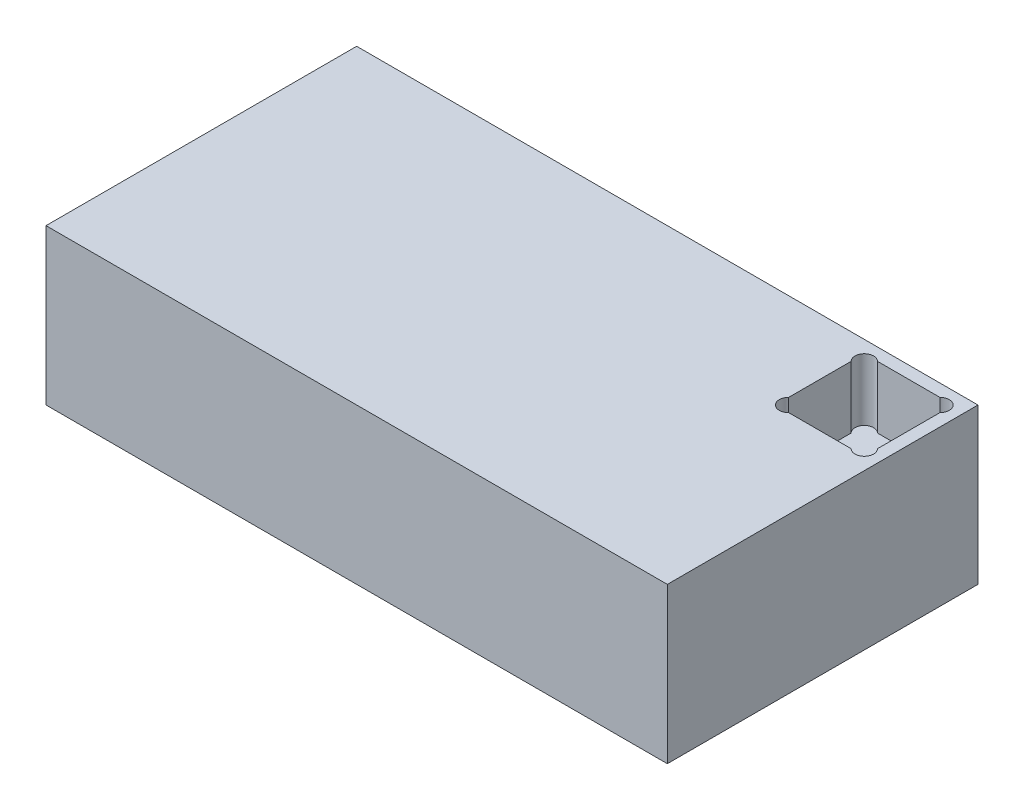
ISO-10303-21;
HEADER;
FILE_DESCRIPTION(('STEP AP214'),'2;1');
FILE_NAME('part.step','',(''),(''),'','','');
FILE_SCHEMA(('AUTOMOTIVE_DESIGN { 1 0 10303 214 1 1 1 1 }'));
ENDSEC;
DATA;
#1=APPLICATION_CONTEXT('core data for automotive mechanical design processes');
#2=APPLICATION_PROTOCOL_DEFINITION('international standard','automotive_design',2000,#1);
#3=PRODUCT_CONTEXT('',#1,'mechanical');
#4=PRODUCT('Part','Part','',(#3));
#5=PRODUCT_RELATED_PRODUCT_CATEGORY('part','',(#4));
#6=PRODUCT_DEFINITION_FORMATION('','',#4);
#7=PRODUCT_DEFINITION_CONTEXT('part definition',#1,'design');
#8=PRODUCT_DEFINITION('design','',#6,#7);
#9=PRODUCT_DEFINITION_SHAPE('','',#8);
#10=(LENGTH_UNIT() NAMED_UNIT(*) SI_UNIT(.MILLI.,.METRE.));
#11=(NAMED_UNIT(*) PLANE_ANGLE_UNIT() SI_UNIT($,.RADIAN.));
#12=(NAMED_UNIT(*) SI_UNIT($,.STERADIAN.) SOLID_ANGLE_UNIT());
#13=UNCERTAINTY_MEASURE_WITH_UNIT(LENGTH_MEASURE(1.E-05),#10,'distance_accuracy_value','');
#14=(GEOMETRIC_REPRESENTATION_CONTEXT(3) GLOBAL_UNCERTAINTY_ASSIGNED_CONTEXT((#13)) GLOBAL_UNIT_ASSIGNED_CONTEXT((#10,
#11,#12)) REPRESENTATION_CONTEXT('',''));
#15=CARTESIAN_POINT('',(0.,0.,0.));
#16=DIRECTION('',(0.,0.,1.));
#17=DIRECTION('',(1.,0.,0.));
#18=AXIS2_PLACEMENT_3D('',#15,#16,#17);
#19=CARTESIAN_POINT('',(50.,-25.,-25.));
#20=DIRECTION('',(1.,0.,0.));
#21=DIRECTION('',(0.,0.,-1.));
#22=AXIS2_PLACEMENT_3D('',#19,#20,#21);
#23=PLANE('',#22);
#24=DIRECTION('',(0.,0.,-1.));
#25=VECTOR('',#24,1.);
#26=CARTESIAN_POINT('',(50.,0.,-25.));
#27=LINE('',#26,#25);
#28=CARTESIAN_POINT('',(50.,0.,25.));
#29=VERTEX_POINT('',#28);
#30=CARTESIAN_POINT('',(50.,0.,-25.));
#31=VERTEX_POINT('',#30);
#32=EDGE_CURVE('E188',#29,#31,#27,.T.);
#33=ORIENTED_EDGE('',*,*,#32,.F.);
#34=DIRECTION('',(0.,1.,0.));
#35=VECTOR('',#34,1.);
#36=CARTESIAN_POINT('',(50.,-25.,25.));
#37=LINE('',#36,#35);
#38=CARTESIAN_POINT('',(50.,-25.,25.));
#39=VERTEX_POINT('',#38);
#40=EDGE_CURVE('E11',#39,#29,#37,.T.);
#41=ORIENTED_EDGE('',*,*,#40,.F.);
#42=DIRECTION('',(0.,0.,-1.));
#43=VECTOR('',#42,1.);
#44=CARTESIAN_POINT('',(50.,-25.,-25.));
#45=LINE('',#44,#43);
#46=CARTESIAN_POINT('',(50.,-25.,-25.));
#47=VERTEX_POINT('',#46);
#48=EDGE_CURVE('E200',#39,#47,#45,.T.);
#49=ORIENTED_EDGE('',*,*,#48,.T.);
#50=DIRECTION('',(0.,1.,0.));
#51=VECTOR('',#50,1.);
#52=CARTESIAN_POINT('',(50.,-25.,-25.));
#53=LINE('',#52,#51);
#54=EDGE_CURVE('E36',#47,#31,#53,.T.);
#55=ORIENTED_EDGE('',*,*,#54,.T.);
#56=EDGE_LOOP('',(#33,#41,#49,#55));
#57=FACE_BOUND('',#56,.T.);
#58=ADVANCED_FACE('F33',(#57),#23,.T.);
#59=CARTESIAN_POINT('',(-50.,-25.,25.));
#60=DIRECTION('',(0.,0.,1.));
#61=DIRECTION('',(1.,0.,0.));
#62=AXIS2_PLACEMENT_3D('',#59,#60,#61);
#63=PLANE('',#62);
#64=DIRECTION('',(1.,0.,0.));
#65=VECTOR('',#64,1.);
#66=CARTESIAN_POINT('',(-50.,0.,25.));
#67=LINE('',#66,#65);
#68=CARTESIAN_POINT('',(-50.,0.,25.));
#69=VERTEX_POINT('',#68);
#70=EDGE_CURVE('E203',#69,#29,#67,.T.);
#71=ORIENTED_EDGE('',*,*,#70,.F.);
#72=DIRECTION('',(0.,1.,0.));
#73=VECTOR('',#72,1.);
#74=CARTESIAN_POINT('',(-50.,-25.,25.));
#75=LINE('',#74,#73);
#76=CARTESIAN_POINT('',(-50.,-25.,25.));
#77=VERTEX_POINT('',#76);
#78=EDGE_CURVE('E41',#77,#69,#75,.T.);
#79=ORIENTED_EDGE('',*,*,#78,.F.);
#80=DIRECTION('',(1.,0.,0.));
#81=VECTOR('',#80,1.);
#82=CARTESIAN_POINT('',(-50.,-25.,25.));
#83=LINE('',#82,#81);
#84=EDGE_CURVE('E208',#77,#39,#83,.T.);
#85=ORIENTED_EDGE('',*,*,#84,.T.);
#86=ORIENTED_EDGE('',*,*,#40,.T.);
#87=EDGE_LOOP('',(#71,#79,#85,#86));
#88=FACE_BOUND('',#87,.T.);
#89=ADVANCED_FACE('F225',(#88),#63,.T.);
#90=CARTESIAN_POINT('',(-50.,-25.,-25.));
#91=DIRECTION('',(-1.,0.,0.));
#92=DIRECTION('',(0.,0.,1.));
#93=AXIS2_PLACEMENT_3D('',#90,#91,#92);
#94=PLANE('',#93);
#95=DIRECTION('',(0.,0.,1.));
#96=VECTOR('',#95,1.);
#97=CARTESIAN_POINT('',(-50.,0.,-25.));
#98=LINE('',#97,#96);
#99=CARTESIAN_POINT('',(-50.,0.,-25.));
#100=VERTEX_POINT('',#99);
#101=EDGE_CURVE('E215',#100,#69,#98,.T.);
#102=ORIENTED_EDGE('',*,*,#101,.F.);
#103=DIRECTION('',(0.,1.,0.));
#104=VECTOR('',#103,1.);
#105=CARTESIAN_POINT('',(-50.,-25.,-25.));
#106=LINE('',#105,#104);
#107=CARTESIAN_POINT('',(-50.,-25.,-25.));
#108=VERTEX_POINT('',#107);
#109=EDGE_CURVE('E220',#108,#100,#106,.T.);
#110=ORIENTED_EDGE('',*,*,#109,.F.);
#111=DIRECTION('',(0.,0.,1.));
#112=VECTOR('',#111,1.);
#113=CARTESIAN_POINT('',(-50.,-25.,-25.));
#114=LINE('',#113,#112);
#115=EDGE_CURVE('E205',#108,#77,#114,.T.);
#116=ORIENTED_EDGE('',*,*,#115,.T.);
#117=ORIENTED_EDGE('',*,*,#78,.T.);
#118=EDGE_LOOP('',(#102,#110,#116,#117));
#119=FACE_BOUND('',#118,.T.);
#120=ADVANCED_FACE('F229',(#119),#94,.T.);
#121=CARTESIAN_POINT('',(-50.,-25.,-25.));
#122=DIRECTION('',(0.,0.,-1.));
#123=DIRECTION('',(-1.,0.,0.));
#124=AXIS2_PLACEMENT_3D('',#121,#122,#123);
#125=PLANE('',#124);
#126=DIRECTION('',(-1.,0.,0.));
#127=VECTOR('',#126,1.);
#128=CARTESIAN_POINT('',(-50.,0.,-25.));
#129=LINE('',#128,#127);
#130=EDGE_CURVE('E212',#31,#100,#129,.T.);
#131=ORIENTED_EDGE('',*,*,#130,.F.);
#132=ORIENTED_EDGE('',*,*,#54,.F.);
#133=DIRECTION('',(-1.,0.,0.));
#134=VECTOR('',#133,1.);
#135=CARTESIAN_POINT('',(-50.,-25.,-25.));
#136=LINE('',#135,#134);
#137=EDGE_CURVE('E202',#47,#108,#136,.T.);
#138=ORIENTED_EDGE('',*,*,#137,.T.);
#139=ORIENTED_EDGE('',*,*,#109,.T.);
#140=EDGE_LOOP('',(#131,#132,#138,#139));
#141=FACE_BOUND('',#140,.T.);
#142=ADVANCED_FACE('F222',(#141),#125,.T.);
#143=CARTESIAN_POINT('',(0.,-25.,0.));
#144=DIRECTION('',(0.,1.,0.));
#145=DIRECTION('',(0.,0.,1.));
#146=AXIS2_PLACEMENT_3D('',#143,#144,#145);
#147=PLANE('',#146);
#148=ORIENTED_EDGE('',*,*,#48,.F.);
#149=ORIENTED_EDGE('',*,*,#84,.F.);
#150=ORIENTED_EDGE('',*,*,#115,.F.);
#151=ORIENTED_EDGE('',*,*,#137,.F.);
#152=EDGE_LOOP('',(#148,#149,#150,#151));
#153=FACE_BOUND('',#152,.T.);
#154=ADVANCED_FACE('F231',(#153),#147,.F.);
#155=CARTESIAN_POINT('',(0.,0.,0.));
#156=DIRECTION('',(0.,1.,0.));
#157=DIRECTION('',(0.,0.,1.));
#158=AXIS2_PLACEMENT_3D('',#155,#156,#157);
#159=PLANE('',#158);
#160=CARTESIAN_POINT('',(34.7606601717798,0.,-21.9393398282202));
#161=DIRECTION('',(0.,1.,0.));
#162=DIRECTION('',(0.,0.,-1.));
#163=AXIS2_PLACEMENT_3D('',#160,#161,#162);
#164=CIRCLE('',#163,1.5);
#165=CARTESIAN_POINT('',(35.8213203435596,0.,-23.));
#166=VERTEX_POINT('',#165);
#167=CARTESIAN_POINT('',(33.7,0.,-20.8786796564404));
#168=VERTEX_POINT('',#167);
#169=EDGE_CURVE('E49',#166,#168,#164,.T.);
#170=ORIENTED_EDGE('',*,*,#169,.F.);
#171=DIRECTION('',(-1.,0.,0.));
#172=VECTOR('',#171,1.);
#173=CARTESIAN_POINT('',(35.8213203435596,0.,-23.));
#174=LINE('',#173,#172);
#175=CARTESIAN_POINT('',(45.8786796564404,0.,-23.));
#176=VERTEX_POINT('',#175);
#177=EDGE_CURVE('E150',#176,#166,#174,.T.);
#178=ORIENTED_EDGE('',*,*,#177,.F.);
#179=CARTESIAN_POINT('',(46.9393398282202,0.,-21.9393398282202));
#180=DIRECTION('',(0.,1.,0.));
#181=DIRECTION('',(0.,0.,1.));
#182=AXIS2_PLACEMENT_3D('',#179,#180,#181);
#183=CIRCLE('',#182,1.5);
#184=CARTESIAN_POINT('',(48.,0.,-20.8786796564404));
#185=VERTEX_POINT('',#184);
#186=EDGE_CURVE('E153',#185,#176,#183,.T.);
#187=ORIENTED_EDGE('',*,*,#186,.F.);
#188=DIRECTION('',(0.,0.,-1.));
#189=VECTOR('',#188,1.);
#190=CARTESIAN_POINT('',(48.,0.,-20.8786796564404));
#191=LINE('',#190,#189);
#192=CARTESIAN_POINT('',(48.,0.,-10.8213203435597));
#193=VERTEX_POINT('',#192);
#194=EDGE_CURVE('E181',#193,#185,#191,.T.);
#195=ORIENTED_EDGE('',*,*,#194,.F.);
#196=CARTESIAN_POINT('',(46.9393398282202,0.,-9.76066017177983));
#197=DIRECTION('',(0.,1.,0.));
#198=DIRECTION('',(0.,0.,-1.));
#199=AXIS2_PLACEMENT_3D('',#196,#197,#198);
#200=CIRCLE('',#199,1.5);
#201=CARTESIAN_POINT('',(45.8786796564404,0.,-8.70000000000001));
#202=VERTEX_POINT('',#201);
#203=EDGE_CURVE('E178',#202,#193,#200,.T.);
#204=ORIENTED_EDGE('',*,*,#203,.F.);
#205=DIRECTION('',(1.,0.,0.));
#206=VECTOR('',#205,1.);
#207=CARTESIAN_POINT('',(35.8213203435596,0.,-8.70000000000001));
#208=LINE('',#207,#206);
#209=CARTESIAN_POINT('',(35.8213203435596,0.,-8.70000000000001));
#210=VERTEX_POINT('',#209);
#211=EDGE_CURVE('E175',#210,#202,#208,.T.);
#212=ORIENTED_EDGE('',*,*,#211,.F.);
#213=CARTESIAN_POINT('',(34.7606601717798,0.,-9.76066017177983));
#214=DIRECTION('',(0.,1.,0.));
#215=DIRECTION('',(0.,0.,-1.));
#216=AXIS2_PLACEMENT_3D('',#213,#214,#215);
#217=CIRCLE('',#216,1.5);
#218=CARTESIAN_POINT('',(33.7,0.,-10.8213203435597));
#219=VERTEX_POINT('',#218);
#220=EDGE_CURVE('E172',#219,#210,#217,.T.);
#221=ORIENTED_EDGE('',*,*,#220,.F.);
#222=DIRECTION('',(0.,0.,1.));
#223=VECTOR('',#222,1.);
#224=CARTESIAN_POINT('',(33.7,0.,-20.8786796564404));
#225=LINE('',#224,#223);
#226=EDGE_CURVE('E170',#168,#219,#225,.T.);
#227=ORIENTED_EDGE('',*,*,#226,.F.);
#228=EDGE_LOOP('',(#170,#178,#187,#195,#204,#212,#221,#227));
#229=FACE_BOUND('',#228,.T.);
#230=ORIENTED_EDGE('',*,*,#32,.T.);
#231=ORIENTED_EDGE('',*,*,#130,.T.);
#232=ORIENTED_EDGE('',*,*,#101,.T.);
#233=ORIENTED_EDGE('',*,*,#70,.T.);
#234=EDGE_LOOP('',(#230,#231,#232,#233));
#235=FACE_BOUND('',#234,.T.);
#236=ADVANCED_FACE('F224',(#229,#235),#159,.T.);
#237=CARTESIAN_POINT('',(34.7606601717798,-10.,-21.9393398282202));
#238=DIRECTION('',(0.,1.,0.));
#239=DIRECTION('',(0.,0.,1.));
#240=AXIS2_PLACEMENT_3D('',#237,#238,#239);
#241=CYLINDRICAL_SURFACE('',#240,1.5);
#242=ORIENTED_EDGE('',*,*,#169,.T.);
#243=DIRECTION('',(0.,1.,0.));
#244=VECTOR('',#243,1.);
#245=CARTESIAN_POINT('',(33.7,-10.,-20.8786796564404));
#246=LINE('',#245,#244);
#247=CARTESIAN_POINT('',(33.7,-10.,-20.8786796564404));
#248=VERTEX_POINT('',#247);
#249=EDGE_CURVE('E127',#248,#168,#246,.T.);
#250=ORIENTED_EDGE('',*,*,#249,.F.);
#251=CARTESIAN_POINT('',(34.7606601717798,-10.,-21.9393398282202));
#252=DIRECTION('',(0.,1.,0.));
#253=DIRECTION('',(0.,0.,-1.));
#254=AXIS2_PLACEMENT_3D('',#251,#252,#253);
#255=CIRCLE('',#254,1.5);
#256=CARTESIAN_POINT('',(35.8213203435596,-10.,-23.));
#257=VERTEX_POINT('',#256);
#258=EDGE_CURVE('E131',#257,#248,#255,.T.);
#259=ORIENTED_EDGE('',*,*,#258,.F.);
#260=DIRECTION('',(0.,1.,0.));
#261=VECTOR('',#260,1.);
#262=CARTESIAN_POINT('',(35.8213203435596,-10.,-23.));
#263=LINE('',#262,#261);
#264=EDGE_CURVE('E186',#257,#166,#263,.T.);
#265=ORIENTED_EDGE('',*,*,#264,.T.);
#266=EDGE_LOOP('',(#242,#250,#259,#265));
#267=FACE_BOUND('',#266,.T.);
#268=ADVANCED_FACE('F129',(#267),#241,.F.);
#269=CARTESIAN_POINT('',(35.8213203435596,-10.,-23.));
#270=DIRECTION('',(0.,0.,-1.));
#271=DIRECTION('',(-1.,0.,0.));
#272=AXIS2_PLACEMENT_3D('',#269,#270,#271);
#273=PLANE('',#272);
#274=ORIENTED_EDGE('',*,*,#177,.T.);
#275=ORIENTED_EDGE('',*,*,#264,.F.);
#276=DIRECTION('',(-1.,0.,0.));
#277=VECTOR('',#276,1.);
#278=CARTESIAN_POINT('',(35.8213203435596,-10.,-23.));
#279=LINE('',#278,#277);
#280=CARTESIAN_POINT('',(45.8786796564404,-10.,-23.));
#281=VERTEX_POINT('',#280);
#282=EDGE_CURVE('E137',#281,#257,#279,.T.);
#283=ORIENTED_EDGE('',*,*,#282,.F.);
#284=DIRECTION('',(0.,1.,0.));
#285=VECTOR('',#284,1.);
#286=CARTESIAN_POINT('',(45.8786796564404,-10.,-23.));
#287=LINE('',#286,#285);
#288=EDGE_CURVE('E189',#281,#176,#287,.T.);
#289=ORIENTED_EDGE('',*,*,#288,.T.);
#290=EDGE_LOOP('',(#274,#275,#283,#289));
#291=FACE_BOUND('',#290,.T.);
#292=ADVANCED_FACE('F275',(#291),#273,.F.);
#293=CARTESIAN_POINT('',(46.9393398282202,-10.,-21.9393398282202));
#294=DIRECTION('',(0.,1.,0.));
#295=DIRECTION('',(0.,0.,1.));
#296=AXIS2_PLACEMENT_3D('',#293,#294,#295);
#297=CYLINDRICAL_SURFACE('',#296,1.5);
#298=ORIENTED_EDGE('',*,*,#186,.T.);
#299=ORIENTED_EDGE('',*,*,#288,.F.);
#300=CARTESIAN_POINT('',(46.9393398282202,-10.,-21.9393398282202));
#301=DIRECTION('',(0.,1.,0.));
#302=DIRECTION('',(0.,0.,1.));
#303=AXIS2_PLACEMENT_3D('',#300,#301,#302);
#304=CIRCLE('',#303,1.5);
#305=CARTESIAN_POINT('',(48.,-10.,-20.8786796564404));
#306=VERTEX_POINT('',#305);
#307=EDGE_CURVE('E166',#306,#281,#304,.T.);
#308=ORIENTED_EDGE('',*,*,#307,.F.);
#309=DIRECTION('',(0.,1.,0.));
#310=VECTOR('',#309,1.);
#311=CARTESIAN_POINT('',(48.,-10.,-20.8786796564404));
#312=LINE('',#311,#310);
#313=EDGE_CURVE('E191',#306,#185,#312,.T.);
#314=ORIENTED_EDGE('',*,*,#313,.T.);
#315=EDGE_LOOP('',(#298,#299,#308,#314));
#316=FACE_BOUND('',#315,.T.);
#317=ADVANCED_FACE('F283',(#316),#297,.F.);
#318=CARTESIAN_POINT('',(48.,-10.,-20.8786796564404));
#319=DIRECTION('',(1.,0.,0.));
#320=DIRECTION('',(0.,0.,-1.));
#321=AXIS2_PLACEMENT_3D('',#318,#319,#320);
#322=PLANE('',#321);
#323=ORIENTED_EDGE('',*,*,#194,.T.);
#324=ORIENTED_EDGE('',*,*,#313,.F.);
#325=DIRECTION('',(0.,0.,-1.));
#326=VECTOR('',#325,1.);
#327=CARTESIAN_POINT('',(48.,-10.,-20.8786796564404));
#328=LINE('',#327,#326);
#329=CARTESIAN_POINT('',(48.,-10.,-10.8213203435597));
#330=VERTEX_POINT('',#329);
#331=EDGE_CURVE('E163',#330,#306,#328,.T.);
#332=ORIENTED_EDGE('',*,*,#331,.F.);
#333=DIRECTION('',(0.,1.,0.));
#334=VECTOR('',#333,1.);
#335=CARTESIAN_POINT('',(48.,-10.,-10.8213203435597));
#336=LINE('',#335,#334);
#337=EDGE_CURVE('E193',#330,#193,#336,.T.);
#338=ORIENTED_EDGE('',*,*,#337,.T.);
#339=EDGE_LOOP('',(#323,#324,#332,#338));
#340=FACE_BOUND('',#339,.T.);
#341=ADVANCED_FACE('F293',(#340),#322,.F.);
#342=CARTESIAN_POINT('',(46.9393398282202,-10.,-9.76066017177983));
#343=DIRECTION('',(0.,1.,0.));
#344=DIRECTION('',(0.,0.,1.));
#345=AXIS2_PLACEMENT_3D('',#342,#343,#344);
#346=CYLINDRICAL_SURFACE('',#345,1.5);
#347=ORIENTED_EDGE('',*,*,#203,.T.);
#348=ORIENTED_EDGE('',*,*,#337,.F.);
#349=CARTESIAN_POINT('',(46.9393398282202,-10.,-9.76066017177983));
#350=DIRECTION('',(0.,1.,0.));
#351=DIRECTION('',(0.,0.,-1.));
#352=AXIS2_PLACEMENT_3D('',#349,#350,#351);
#353=CIRCLE('',#352,1.5);
#354=CARTESIAN_POINT('',(45.8786796564404,-10.,-8.70000000000001));
#355=VERTEX_POINT('',#354);
#356=EDGE_CURVE('E160',#355,#330,#353,.T.);
#357=ORIENTED_EDGE('',*,*,#356,.F.);
#358=DIRECTION('',(0.,1.,0.));
#359=VECTOR('',#358,1.);
#360=CARTESIAN_POINT('',(45.8786796564404,-10.,-8.70000000000001));
#361=LINE('',#360,#359);
#362=EDGE_CURVE('E195',#355,#202,#361,.T.);
#363=ORIENTED_EDGE('',*,*,#362,.T.);
#364=EDGE_LOOP('',(#347,#348,#357,#363));
#365=FACE_BOUND('',#364,.T.);
#366=ADVANCED_FACE('F303',(#365),#346,.F.);
#367=CARTESIAN_POINT('',(35.8213203435596,-10.,-8.70000000000001));
#368=DIRECTION('',(0.,0.,1.));
#369=DIRECTION('',(1.,0.,0.));
#370=AXIS2_PLACEMENT_3D('',#367,#368,#369);
#371=PLANE('',#370);
#372=ORIENTED_EDGE('',*,*,#211,.T.);
#373=ORIENTED_EDGE('',*,*,#362,.F.);
#374=DIRECTION('',(1.,0.,0.));
#375=VECTOR('',#374,1.);
#376=CARTESIAN_POINT('',(35.8213203435596,-10.,-8.70000000000001));
#377=LINE('',#376,#375);
#378=CARTESIAN_POINT('',(35.8213203435596,-10.,-8.70000000000001));
#379=VERTEX_POINT('',#378);
#380=EDGE_CURVE('E157',#379,#355,#377,.T.);
#381=ORIENTED_EDGE('',*,*,#380,.F.);
#382=DIRECTION('',(0.,1.,0.));
#383=VECTOR('',#382,1.);
#384=CARTESIAN_POINT('',(35.8213203435596,-10.,-8.70000000000001));
#385=LINE('',#384,#383);
#386=EDGE_CURVE('E197',#379,#210,#385,.T.);
#387=ORIENTED_EDGE('',*,*,#386,.T.);
#388=EDGE_LOOP('',(#372,#373,#381,#387));
#389=FACE_BOUND('',#388,.T.);
#390=ADVANCED_FACE('F313',(#389),#371,.F.);
#391=CARTESIAN_POINT('',(34.7606601717798,-10.,-9.76066017177983));
#392=DIRECTION('',(0.,1.,0.));
#393=DIRECTION('',(0.,0.,1.));
#394=AXIS2_PLACEMENT_3D('',#391,#392,#393);
#395=CYLINDRICAL_SURFACE('',#394,1.5);
#396=ORIENTED_EDGE('',*,*,#220,.T.);
#397=ORIENTED_EDGE('',*,*,#386,.F.);
#398=CARTESIAN_POINT('',(34.7606601717798,-10.,-9.76066017177983));
#399=DIRECTION('',(0.,1.,0.));
#400=DIRECTION('',(0.,0.,-1.));
#401=AXIS2_PLACEMENT_3D('',#398,#399,#400);
#402=CIRCLE('',#401,1.5);
#403=CARTESIAN_POINT('',(33.7,-10.,-10.8213203435597));
#404=VERTEX_POINT('',#403);
#405=EDGE_CURVE('E145',#404,#379,#402,.T.);
#406=ORIENTED_EDGE('',*,*,#405,.F.);
#407=DIRECTION('',(0.,1.,0.));
#408=VECTOR('',#407,1.);
#409=CARTESIAN_POINT('',(33.7,-10.,-10.8213203435597));
#410=LINE('',#409,#408);
#411=EDGE_CURVE('E136',#404,#219,#410,.T.);
#412=ORIENTED_EDGE('',*,*,#411,.T.);
#413=EDGE_LOOP('',(#396,#397,#406,#412));
#414=FACE_BOUND('',#413,.T.);
#415=ADVANCED_FACE('F323',(#414),#395,.F.);
#416=CARTESIAN_POINT('',(33.7,-10.,-20.8786796564404));
#417=DIRECTION('',(-1.,0.,0.));
#418=DIRECTION('',(0.,0.,1.));
#419=AXIS2_PLACEMENT_3D('',#416,#417,#418);
#420=PLANE('',#419);
#421=ORIENTED_EDGE('',*,*,#226,.T.);
#422=ORIENTED_EDGE('',*,*,#411,.F.);
#423=DIRECTION('',(0.,0.,1.));
#424=VECTOR('',#423,1.);
#425=CARTESIAN_POINT('',(33.7,-10.,-20.8786796564404));
#426=LINE('',#425,#424);
#427=EDGE_CURVE('E140',#248,#404,#426,.T.);
#428=ORIENTED_EDGE('',*,*,#427,.F.);
#429=ORIENTED_EDGE('',*,*,#249,.T.);
#430=EDGE_LOOP('',(#421,#422,#428,#429));
#431=FACE_BOUND('',#430,.T.);
#432=ADVANCED_FACE('F141',(#431),#420,.F.);
#433=CARTESIAN_POINT('',(34.7606601717798,-10.,-21.9393398282202));
#434=DIRECTION('',(0.,-1.,0.));
#435=DIRECTION('',(0.,0.,-1.));
#436=AXIS2_PLACEMENT_3D('',#433,#434,#435);
#437=PLANE('',#436);
#438=ORIENTED_EDGE('',*,*,#258,.T.);
#439=ORIENTED_EDGE('',*,*,#427,.T.);
#440=ORIENTED_EDGE('',*,*,#405,.T.);
#441=ORIENTED_EDGE('',*,*,#380,.T.);
#442=ORIENTED_EDGE('',*,*,#356,.T.);
#443=ORIENTED_EDGE('',*,*,#331,.T.);
#444=ORIENTED_EDGE('',*,*,#307,.T.);
#445=ORIENTED_EDGE('',*,*,#282,.T.);
#446=EDGE_LOOP('',(#438,#439,#440,#441,#442,#443,#444,#445));
#447=FACE_BOUND('',#446,.T.);
#448=ADVANCED_FACE('F147',(#447),#437,.F.);
#449=CLOSED_SHELL('',(#58,#89,#120,#142,#154,#236,#268,#292,#317,#341,#366,#390,#415,#432,#448));
#450=MANIFOLD_SOLID_BREP('B2',#449);
#451=ADVANCED_BREP_SHAPE_REPRESENTATION('',(#18,#450),#14);
#452=SHAPE_DEFINITION_REPRESENTATION(#9,#451);
ENDSEC;
END-ISO-10303-21;
